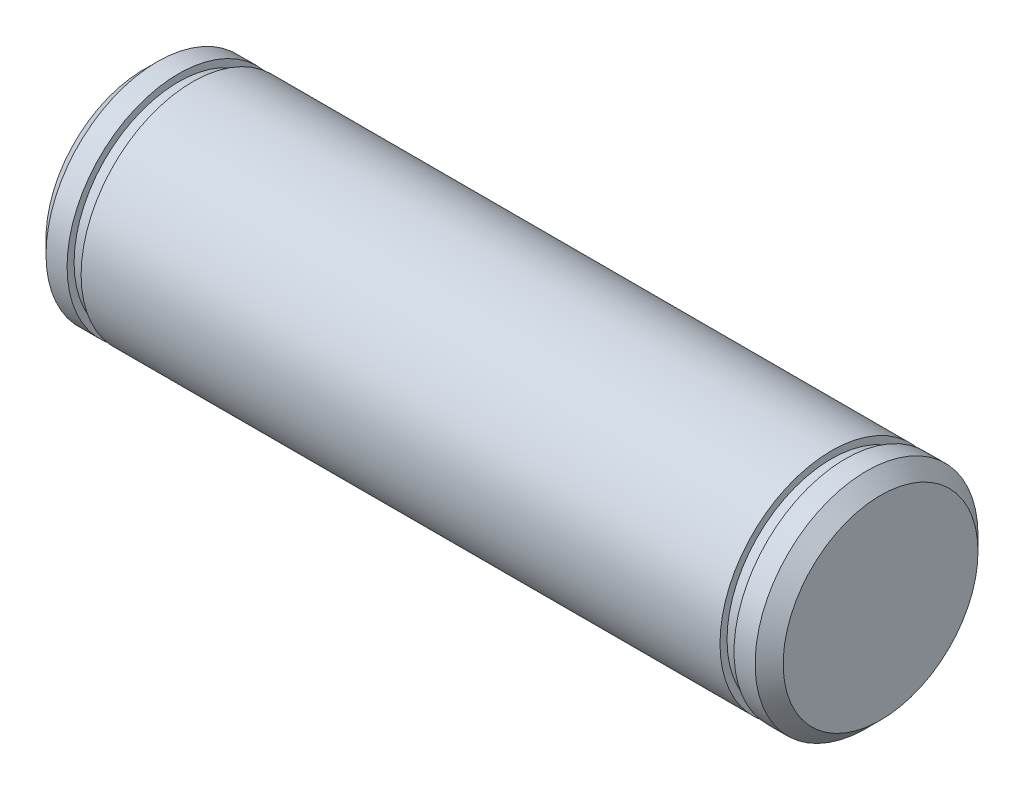
ISO-10303-21;
HEADER;
FILE_DESCRIPTION(('STEP AP214'),'2;1');
FILE_NAME('part.step','',(''),(''),'','','');
FILE_SCHEMA(('AUTOMOTIVE_DESIGN { 1 0 10303 214 1 1 1 1 }'));
ENDSEC;
DATA;
#1=APPLICATION_CONTEXT('core data for automotive mechanical design processes');
#2=APPLICATION_PROTOCOL_DEFINITION('international standard','automotive_design',2000,#1);
#3=PRODUCT_CONTEXT('',#1,'mechanical');
#4=PRODUCT('Part','Part','',(#3));
#5=PRODUCT_RELATED_PRODUCT_CATEGORY('part','',(#4));
#6=PRODUCT_DEFINITION_FORMATION('','',#4);
#7=PRODUCT_DEFINITION_CONTEXT('part definition',#1,'design');
#8=PRODUCT_DEFINITION('design','',#6,#7);
#9=PRODUCT_DEFINITION_SHAPE('','',#8);
#10=(LENGTH_UNIT() NAMED_UNIT(*) SI_UNIT(.MILLI.,.METRE.));
#11=(NAMED_UNIT(*) PLANE_ANGLE_UNIT() SI_UNIT($,.RADIAN.));
#12=(NAMED_UNIT(*) SI_UNIT($,.STERADIAN.) SOLID_ANGLE_UNIT());
#13=UNCERTAINTY_MEASURE_WITH_UNIT(LENGTH_MEASURE(1.E-05),#10,'distance_accuracy_value','');
#14=(GEOMETRIC_REPRESENTATION_CONTEXT(3) GLOBAL_UNCERTAINTY_ASSIGNED_CONTEXT((#13)) GLOBAL_UNIT_ASSIGNED_CONTEXT((#10,
#11,#12)) REPRESENTATION_CONTEXT('',''));
#15=CARTESIAN_POINT('',(0.,0.,0.));
#16=DIRECTION('',(0.,0.,1.));
#17=DIRECTION('',(1.,0.,0.));
#18=AXIS2_PLACEMENT_3D('',#15,#16,#17);
#19=CARTESIAN_POINT('',(52.5,0.,0.));
#20=DIRECTION('',(-1.,0.,0.));
#21=DIRECTION('',(0.,0.,1.));
#22=AXIS2_PLACEMENT_3D('',#19,#20,#21);
#23=CYLINDRICAL_SURFACE('',#22,15.875);
#24=CARTESIAN_POINT('',(-45.5,0.,0.));
#25=DIRECTION('',(-1.,0.,0.));
#26=DIRECTION('',(0.,0.,1.));
#27=AXIS2_PLACEMENT_3D('',#24,#25,#26);
#28=CIRCLE('',#27,15.875);
#29=CARTESIAN_POINT('',(-45.5,0.,15.875));
#30=VERTEX_POINT('',#29);
#31=EDGE_CURVE('E88',#30,#30,#28,.T.);
#32=ORIENTED_EDGE('',*,*,#31,.F.);
#33=EDGE_LOOP('',(#32));
#34=FACE_BOUND('',#33,.T.);
#35=CARTESIAN_POINT('',(45.5,0.,0.));
#36=DIRECTION('',(1.,0.,0.));
#37=DIRECTION('',(0.,0.,-1.));
#38=AXIS2_PLACEMENT_3D('',#35,#36,#37);
#39=CIRCLE('',#38,15.875);
#40=CARTESIAN_POINT('',(45.5,0.,-15.875));
#41=VERTEX_POINT('',#40);
#42=EDGE_CURVE('E72',#41,#41,#39,.T.);
#43=ORIENTED_EDGE('',*,*,#42,.F.);
#44=EDGE_LOOP('',(#43));
#45=FACE_BOUND('',#44,.T.);
#46=ADVANCED_FACE('F67',(#34,#45),#23,.T.);
#47=CARTESIAN_POINT('',(-45.5,0.,0.));
#48=DIRECTION('',(-1.,0.,0.));
#49=DIRECTION('',(0.,0.,1.));
#50=AXIS2_PLACEMENT_3D('',#47,#48,#49);
#51=PLANE('',#50);
#52=CARTESIAN_POINT('',(-45.5,0.,0.));
#53=DIRECTION('',(-1.,0.,0.));
#54=DIRECTION('',(0.,0.,1.));
#55=AXIS2_PLACEMENT_3D('',#52,#53,#54);
#56=CIRCLE('',#55,14.875);
#57=CARTESIAN_POINT('',(-45.5,0.,14.875));
#58=VERTEX_POINT('',#57);
#59=EDGE_CURVE('E89',#58,#58,#56,.T.);
#60=ORIENTED_EDGE('',*,*,#59,.F.);
#61=EDGE_LOOP('',(#60));
#62=FACE_BOUND('',#61,.T.);
#63=ORIENTED_EDGE('',*,*,#31,.T.);
#64=EDGE_LOOP('',(#63));
#65=FACE_BOUND('',#64,.T.);
#66=ADVANCED_FACE('F135',(#62,#65),#51,.T.);
#67=CARTESIAN_POINT('',(-47.5,0.,0.));
#68=DIRECTION('',(-1.,0.,0.));
#69=DIRECTION('',(0.,0.,1.));
#70=AXIS2_PLACEMENT_3D('',#67,#68,#69);
#71=PLANE('',#70);
#72=CARTESIAN_POINT('',(-47.5,0.,0.));
#73=DIRECTION('',(-1.,0.,0.));
#74=DIRECTION('',(0.,0.,1.));
#75=AXIS2_PLACEMENT_3D('',#72,#73,#74);
#76=CIRCLE('',#75,14.875);
#77=CARTESIAN_POINT('',(-47.5,0.,14.875));
#78=VERTEX_POINT('',#77);
#79=EDGE_CURVE('E98',#78,#78,#76,.T.);
#80=ORIENTED_EDGE('',*,*,#79,.T.);
#81=EDGE_LOOP('',(#80));
#82=FACE_BOUND('',#81,.T.);
#83=CARTESIAN_POINT('',(-47.5,0.,0.));
#84=DIRECTION('',(-1.,0.,0.));
#85=DIRECTION('',(0.,0.,1.));
#86=AXIS2_PLACEMENT_3D('',#83,#84,#85);
#87=CIRCLE('',#86,15.875);
#88=CARTESIAN_POINT('',(-47.5,0.,15.875));
#89=VERTEX_POINT('',#88);
#90=EDGE_CURVE('E85',#89,#89,#87,.T.);
#91=ORIENTED_EDGE('',*,*,#90,.F.);
#92=EDGE_LOOP('',(#91));
#93=FACE_BOUND('',#92,.T.);
#94=ADVANCED_FACE('F140',(#82,#93),#71,.F.);
#95=CARTESIAN_POINT('',(-45.5,0.,0.));
#96=DIRECTION('',(-1.,0.,0.));
#97=DIRECTION('',(0.,0.,1.));
#98=AXIS2_PLACEMENT_3D('',#95,#96,#97);
#99=CYLINDRICAL_SURFACE('',#98,14.875);
#100=ORIENTED_EDGE('',*,*,#59,.T.);
#101=EDGE_LOOP('',(#100));
#102=FACE_BOUND('',#101,.T.);
#103=ORIENTED_EDGE('',*,*,#79,.F.);
#104=EDGE_LOOP('',(#103));
#105=FACE_BOUND('',#104,.T.);
#106=ADVANCED_FACE('F129',(#102,#105),#99,.T.);
#107=CARTESIAN_POINT('',(-52.5,0.,0.));
#108=DIRECTION('',(1.,0.,0.));
#109=DIRECTION('',(0.,0.,-1.));
#110=AXIS2_PLACEMENT_3D('',#107,#108,#109);
#111=PLANE('',#110);
#112=CARTESIAN_POINT('',(-52.5,0.,0.));
#113=DIRECTION('',(1.,0.,0.));
#114=DIRECTION('',(0.,0.,-1.));
#115=AXIS2_PLACEMENT_3D('',#112,#113,#114);
#116=CIRCLE('',#115,13.875);
#117=CARTESIAN_POINT('',(-52.5,0.,-13.875));
#118=VERTEX_POINT('',#117);
#119=EDGE_CURVE('E76',#118,#118,#116,.F.);
#120=ORIENTED_EDGE('',*,*,#119,.T.);
#121=EDGE_LOOP('',(#120));
#122=FACE_BOUND('',#121,.T.);
#123=ADVANCED_FACE('F119',(#122),#111,.F.);
#124=CARTESIAN_POINT('',(-50.5,0.,0.));
#125=DIRECTION('',(1.,0.,0.));
#126=DIRECTION('',(0.,0.,-1.));
#127=AXIS2_PLACEMENT_3D('',#124,#125,#126);
#128=CONICAL_SURFACE('',#127,15.875,0.785398163397452);
#129=ORIENTED_EDGE('',*,*,#119,.F.);
#130=EDGE_LOOP('',(#129));
#131=FACE_BOUND('',#130,.T.);
#132=CARTESIAN_POINT('',(-50.5,0.,0.));
#133=DIRECTION('',(1.,0.,0.));
#134=DIRECTION('',(0.,0.,-1.));
#135=AXIS2_PLACEMENT_3D('',#132,#133,#134);
#136=CIRCLE('',#135,15.875);
#137=CARTESIAN_POINT('',(-50.5,0.,-15.875));
#138=VERTEX_POINT('',#137);
#139=EDGE_CURVE('E81',#138,#138,#136,.T.);
#140=ORIENTED_EDGE('',*,*,#139,.F.);
#141=EDGE_LOOP('',(#140));
#142=FACE_BOUND('',#141,.T.);
#143=ADVANCED_FACE('F117',(#131,#142),#128,.T.);
#144=ORIENTED_EDGE('',*,*,#90,.T.);
#145=EDGE_LOOP('',(#144));
#146=FACE_BOUND('',#145,.T.);
#147=ORIENTED_EDGE('',*,*,#139,.T.);
#148=EDGE_LOOP('',(#147));
#149=FACE_BOUND('',#148,.T.);
#150=ADVANCED_FACE('F115',(#146,#149),#23,.T.);
#151=CARTESIAN_POINT('',(45.5,0.,0.));
#152=DIRECTION('',(1.,0.,0.));
#153=DIRECTION('',(0.,0.,-1.));
#154=AXIS2_PLACEMENT_3D('',#151,#152,#153);
#155=PLANE('',#154);
#156=CARTESIAN_POINT('',(45.5,0.,0.));
#157=DIRECTION('',(-1.,0.,0.));
#158=DIRECTION('',(0.,0.,1.));
#159=AXIS2_PLACEMENT_3D('',#156,#157,#158);
#160=CIRCLE('',#159,14.875);
#161=CARTESIAN_POINT('',(45.5,0.,14.875));
#162=VERTEX_POINT('',#161);
#163=EDGE_CURVE('E94',#162,#162,#160,.T.);
#164=ORIENTED_EDGE('',*,*,#163,.T.);
#165=EDGE_LOOP('',(#164));
#166=FACE_BOUND('',#165,.T.);
#167=ORIENTED_EDGE('',*,*,#42,.T.);
#168=EDGE_LOOP('',(#167));
#169=FACE_BOUND('',#168,.T.);
#170=ADVANCED_FACE('F125',(#166,#169),#155,.T.);
#171=CARTESIAN_POINT('',(47.5,0.,0.));
#172=DIRECTION('',(1.,0.,0.));
#173=DIRECTION('',(0.,0.,-1.));
#174=AXIS2_PLACEMENT_3D('',#171,#172,#173);
#175=PLANE('',#174);
#176=CARTESIAN_POINT('',(47.5,0.,0.));
#177=DIRECTION('',(-1.,0.,0.));
#178=DIRECTION('',(0.,0.,1.));
#179=AXIS2_PLACEMENT_3D('',#176,#177,#178);
#180=CIRCLE('',#179,14.875);
#181=CARTESIAN_POINT('',(47.5,0.,14.875));
#182=VERTEX_POINT('',#181);
#183=EDGE_CURVE('E100',#182,#182,#180,.T.);
#184=ORIENTED_EDGE('',*,*,#183,.F.);
#185=EDGE_LOOP('',(#184));
#186=FACE_BOUND('',#185,.T.);
#187=CARTESIAN_POINT('',(47.5,0.,0.));
#188=DIRECTION('',(1.,0.,0.));
#189=DIRECTION('',(0.,0.,-1.));
#190=AXIS2_PLACEMENT_3D('',#187,#188,#189);
#191=CIRCLE('',#190,15.875);
#192=CARTESIAN_POINT('',(47.5,0.,-15.875));
#193=VERTEX_POINT('',#192);
#194=EDGE_CURVE('E92',#193,#193,#191,.T.);
#195=ORIENTED_EDGE('',*,*,#194,.F.);
#196=EDGE_LOOP('',(#195));
#197=FACE_BOUND('',#196,.T.);
#198=ADVANCED_FACE('F162',(#186,#197),#175,.F.);
#199=CARTESIAN_POINT('',(45.5,0.,0.));
#200=DIRECTION('',(1.,0.,0.));
#201=DIRECTION('',(0.,0.,-1.));
#202=AXIS2_PLACEMENT_3D('',#199,#200,#201);
#203=CYLINDRICAL_SURFACE('',#202,14.875);
#204=ORIENTED_EDGE('',*,*,#163,.F.);
#205=EDGE_LOOP('',(#204));
#206=FACE_BOUND('',#205,.T.);
#207=ORIENTED_EDGE('',*,*,#183,.T.);
#208=EDGE_LOOP('',(#207));
#209=FACE_BOUND('',#208,.T.);
#210=ADVANCED_FACE('F157',(#206,#209),#203,.T.);
#211=CARTESIAN_POINT('',(52.5,0.,0.));
#212=DIRECTION('',(1.,0.,0.));
#213=DIRECTION('',(0.,0.,-1.));
#214=AXIS2_PLACEMENT_3D('',#211,#212,#213);
#215=PLANE('',#214);
#216=CARTESIAN_POINT('',(52.5,0.,0.));
#217=DIRECTION('',(1.,0.,0.));
#218=DIRECTION('',(0.,0.,-1.));
#219=AXIS2_PLACEMENT_3D('',#216,#217,#218);
#220=CIRCLE('',#219,13.875);
#221=CARTESIAN_POINT('',(52.5,0.,-13.875));
#222=VERTEX_POINT('',#221);
#223=EDGE_CURVE('E12',#222,#222,#220,.T.);
#224=ORIENTED_EDGE('',*,*,#223,.T.);
#225=EDGE_LOOP('',(#224));
#226=FACE_BOUND('',#225,.T.);
#227=ADVANCED_FACE('F149',(#226),#215,.T.);
#228=CARTESIAN_POINT('',(52.5,0.,0.));
#229=DIRECTION('',(-1.,0.,0.));
#230=DIRECTION('',(0.,0.,1.));
#231=AXIS2_PLACEMENT_3D('',#228,#229,#230);
#232=CONICAL_SURFACE('',#231,13.875,0.785398163397443);
#233=CARTESIAN_POINT('',(50.5,0.,0.));
#234=DIRECTION('',(1.,0.,0.));
#235=DIRECTION('',(0.,0.,-1.));
#236=AXIS2_PLACEMENT_3D('',#233,#234,#235);
#237=CIRCLE('',#236,15.875);
#238=CARTESIAN_POINT('',(50.5,0.,-15.875));
#239=VERTEX_POINT('',#238);
#240=EDGE_CURVE('E91',#239,#239,#237,.F.);
#241=ORIENTED_EDGE('',*,*,#240,.F.);
#242=EDGE_LOOP('',(#241));
#243=FACE_BOUND('',#242,.T.);
#244=ORIENTED_EDGE('',*,*,#223,.F.);
#245=EDGE_LOOP('',(#244));
#246=FACE_BOUND('',#245,.T.);
#247=ADVANCED_FACE('F70',(#243,#246),#232,.T.);
#248=ORIENTED_EDGE('',*,*,#194,.T.);
#249=EDGE_LOOP('',(#248));
#250=FACE_BOUND('',#249,.T.);
#251=ORIENTED_EDGE('',*,*,#240,.T.);
#252=EDGE_LOOP('',(#251));
#253=FACE_BOUND('',#252,.T.);
#254=ADVANCED_FACE('F128',(#250,#253),#23,.T.);
#255=CLOSED_SHELL('',(#46,#66,#94,#106,#123,#143,#150,#170,#198,#210,#227,#247,#254));
#256=MANIFOLD_SOLID_BREP('B2',#255);
#257=ADVANCED_BREP_SHAPE_REPRESENTATION('',(#18,#256),#14);
#258=SHAPE_DEFINITION_REPRESENTATION(#9,#257);
ENDSEC;
END-ISO-10303-21;
